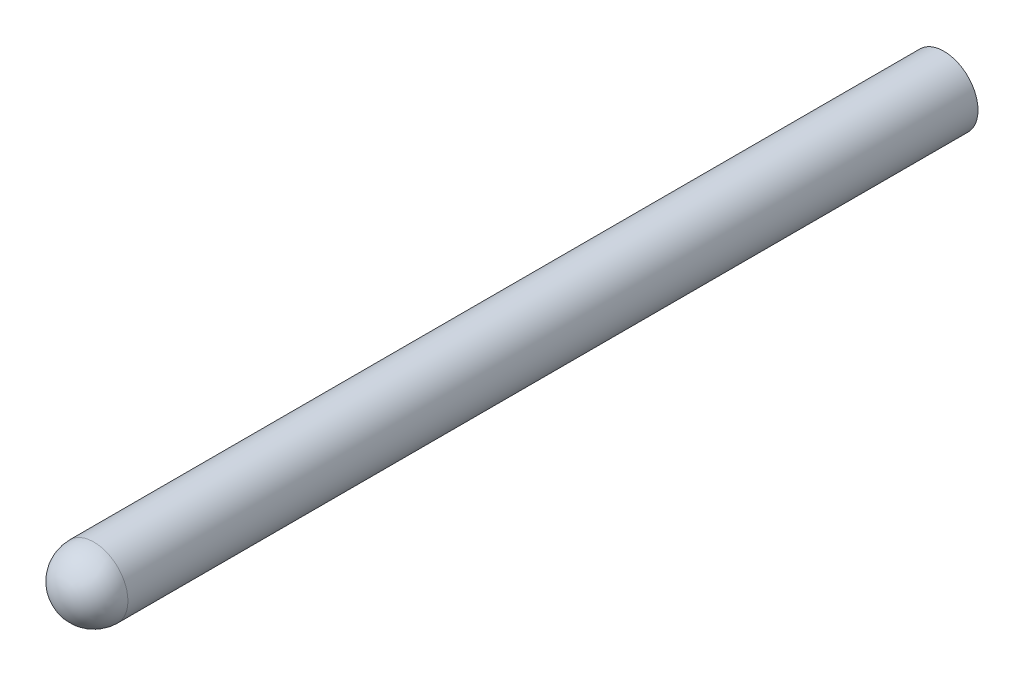
ISO-10303-21;
HEADER;
FILE_DESCRIPTION(('STEP AP214'),'2;1');
FILE_NAME('part.step','',(''),(''),'','','');
FILE_SCHEMA(('AUTOMOTIVE_DESIGN { 1 0 10303 214 1 1 1 1 }'));
ENDSEC;
DATA;
#1=APPLICATION_CONTEXT('core data for automotive mechanical design processes');
#2=APPLICATION_PROTOCOL_DEFINITION('international standard','automotive_design',2000,#1);
#3=PRODUCT_CONTEXT('',#1,'mechanical');
#4=PRODUCT('Part','Part','',(#3));
#5=PRODUCT_RELATED_PRODUCT_CATEGORY('part','',(#4));
#6=PRODUCT_DEFINITION_FORMATION('','',#4);
#7=PRODUCT_DEFINITION_CONTEXT('part definition',#1,'design');
#8=PRODUCT_DEFINITION('design','',#6,#7);
#9=PRODUCT_DEFINITION_SHAPE('','',#8);
#10=(LENGTH_UNIT() NAMED_UNIT(*) SI_UNIT(.MILLI.,.METRE.));
#11=(NAMED_UNIT(*) PLANE_ANGLE_UNIT() SI_UNIT($,.RADIAN.));
#12=(NAMED_UNIT(*) SI_UNIT($,.STERADIAN.) SOLID_ANGLE_UNIT());
#13=UNCERTAINTY_MEASURE_WITH_UNIT(LENGTH_MEASURE(1.E-05),#10,'distance_accuracy_value','');
#14=(GEOMETRIC_REPRESENTATION_CONTEXT(3) GLOBAL_UNCERTAINTY_ASSIGNED_CONTEXT((#13)) GLOBAL_UNIT_ASSIGNED_CONTEXT((#10,
#11,#12)) REPRESENTATION_CONTEXT('',''));
#15=CARTESIAN_POINT('',(0.,0.,0.));
#16=DIRECTION('',(0.,0.,1.));
#17=DIRECTION('',(1.,0.,0.));
#18=AXIS2_PLACEMENT_3D('',#15,#16,#17);
#19=CARTESIAN_POINT('',(0.,0.,100.));
#20=DIRECTION('',(0.,0.,-1.));
#21=DIRECTION('',(-1.,0.,0.));
#22=AXIS2_PLACEMENT_3D('',#19,#20,#21);
#23=CYLINDRICAL_SURFACE('',#22,4.);
#24=CARTESIAN_POINT('',(0.,0.,100.));
#25=DIRECTION('',(0.,0.,1.));
#26=DIRECTION('',(1.,0.,0.));
#27=AXIS2_PLACEMENT_3D('',#24,#25,#26);
#28=CIRCLE('',#27,4.);
#29=CARTESIAN_POINT('',(4.,0.,100.));
#30=VERTEX_POINT('',#29);
#31=EDGE_CURVE('E10',#30,#30,#28,.T.);
#32=ORIENTED_EDGE('',*,*,#31,.F.);
#33=EDGE_LOOP('',(#32));
#34=FACE_BOUND('',#33,.T.);
#35=CARTESIAN_POINT('',(0.,0.,0.));
#36=DIRECTION('',(0.,0.,1.));
#37=DIRECTION('',(1.,0.,0.));
#38=AXIS2_PLACEMENT_3D('',#35,#36,#37);
#39=CIRCLE('',#38,4.);
#40=CARTESIAN_POINT('',(4.,0.,0.));
#41=VERTEX_POINT('',#40);
#42=EDGE_CURVE('E38',#41,#41,#39,.T.);
#43=ORIENTED_EDGE('',*,*,#42,.T.);
#44=EDGE_LOOP('',(#43));
#45=FACE_BOUND('',#44,.T.);
#46=ADVANCED_FACE('F35',(#34,#45),#23,.T.);
#47=CARTESIAN_POINT('',(0.,0.,0.));
#48=DIRECTION('',(0.,0.,1.));
#49=DIRECTION('',(1.,0.,0.));
#50=AXIS2_PLACEMENT_3D('',#47,#48,#49);
#51=PLANE('',#50);
#52=ORIENTED_EDGE('',*,*,#42,.F.);
#53=EDGE_LOOP('',(#52));
#54=FACE_BOUND('',#53,.T.);
#55=ADVANCED_FACE('F48',(#54),#51,.F.);
#56=CARTESIAN_POINT('',(0.,0.,100.));
#57=DIRECTION('',(0.,0.,-1.));
#58=DIRECTION('',(1.,0.,0.));
#59=AXIS2_PLACEMENT_3D('',#56,#57,#58);
#60=SPHERICAL_SURFACE('',#59,4.);
#61=ORIENTED_EDGE('',*,*,#31,.T.);
#62=EDGE_LOOP('',(#61));
#63=FACE_BOUND('',#62,.T.);
#64=ADVANCED_FACE('F50',(#63),#60,.T.);
#65=CLOSED_SHELL('',(#46,#55,#64));
#66=MANIFOLD_SOLID_BREP('B2',#65);
#67=ADVANCED_BREP_SHAPE_REPRESENTATION('',(#18,#66),#14);
#68=SHAPE_DEFINITION_REPRESENTATION(#9,#67);
ENDSEC;
END-ISO-10303-21;
